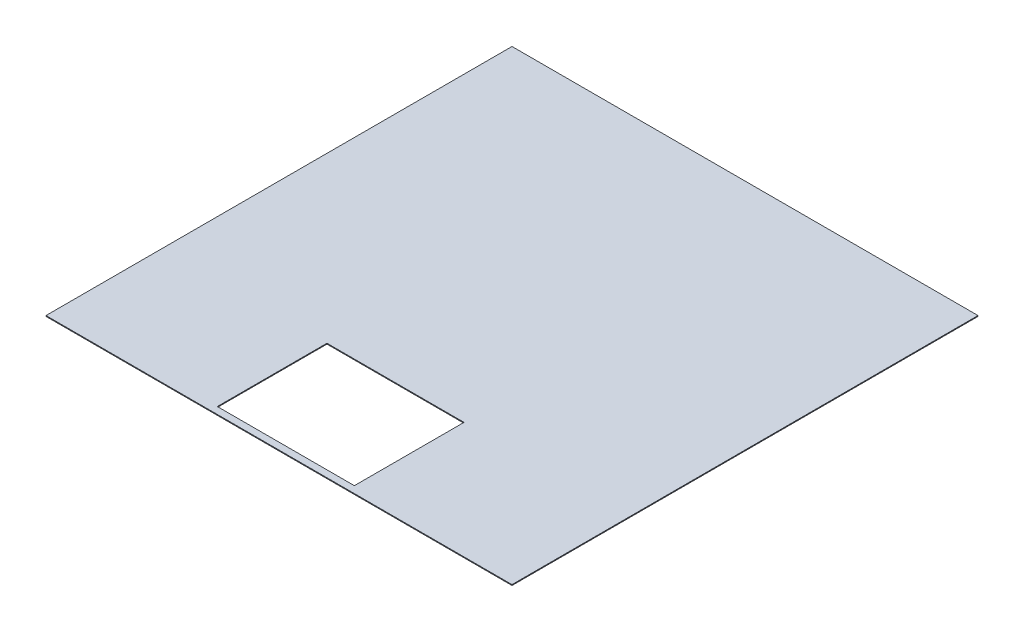
ISO-10303-21;
HEADER;
FILE_DESCRIPTION(('STEP AP214'),'2;1');
FILE_NAME('part.step','',(''),(''),'','','');
FILE_SCHEMA(('AUTOMOTIVE_DESIGN { 1 0 10303 214 1 1 1 1 }'));
ENDSEC;
DATA;
#1=APPLICATION_CONTEXT('core data for automotive mechanical design processes');
#2=APPLICATION_PROTOCOL_DEFINITION('international standard','automotive_design',2000,#1);
#3=PRODUCT_CONTEXT('',#1,'mechanical');
#4=PRODUCT('Part','Part','',(#3));
#5=PRODUCT_RELATED_PRODUCT_CATEGORY('part','',(#4));
#6=PRODUCT_DEFINITION_FORMATION('','',#4);
#7=PRODUCT_DEFINITION_CONTEXT('part definition',#1,'design');
#8=PRODUCT_DEFINITION('design','',#6,#7);
#9=PRODUCT_DEFINITION_SHAPE('','',#8);
#10=(LENGTH_UNIT() NAMED_UNIT(*) SI_UNIT(.MILLI.,.METRE.));
#11=(NAMED_UNIT(*) PLANE_ANGLE_UNIT() SI_UNIT($,.RADIAN.));
#12=(NAMED_UNIT(*) SI_UNIT($,.STERADIAN.) SOLID_ANGLE_UNIT());
#13=UNCERTAINTY_MEASURE_WITH_UNIT(LENGTH_MEASURE(1.E-05),#10,'distance_accuracy_value','');
#14=(GEOMETRIC_REPRESENTATION_CONTEXT(3) GLOBAL_UNCERTAINTY_ASSIGNED_CONTEXT((#13)) GLOBAL_UNIT_ASSIGNED_CONTEXT((#10,
#11,#12)) REPRESENTATION_CONTEXT('',''));
#15=CARTESIAN_POINT('',(0.,0.,0.));
#16=DIRECTION('',(0.,0.,1.));
#17=DIRECTION('',(1.,0.,0.));
#18=AXIS2_PLACEMENT_3D('',#15,#16,#17);
#19=CARTESIAN_POINT('',(0.,0.6,0.));
#20=DIRECTION('',(0.,-1.,0.));
#21=DIRECTION('',(0.,0.,-1.));
#22=AXIS2_PLACEMENT_3D('',#19,#20,#21);
#23=PLANE('',#22);
#24=DIRECTION('',(0.,0.,1.));
#25=VECTOR('',#24,1.);
#26=CARTESIAN_POINT('',(0.,0.6,340.));
#27=LINE('',#26,#25);
#28=CARTESIAN_POINT('',(0.,0.6,0.));
#29=VERTEX_POINT('',#28);
#30=CARTESIAN_POINT('',(0.,0.6,340.));
#31=VERTEX_POINT('',#30);
#32=EDGE_CURVE('E153',#29,#31,#27,.T.);
#33=ORIENTED_EDGE('',*,*,#32,.T.);
#34=DIRECTION('',(1.,0.,0.));
#35=VECTOR('',#34,1.);
#36=CARTESIAN_POINT('',(340.,0.6,340.));
#37=LINE('',#36,#35);
#38=CARTESIAN_POINT('',(340.,0.6,340.));
#39=VERTEX_POINT('',#38);
#40=EDGE_CURVE('E157',#31,#39,#37,.T.);
#41=ORIENTED_EDGE('',*,*,#40,.T.);
#42=DIRECTION('',(0.,0.,-1.));
#43=VECTOR('',#42,1.);
#44=CARTESIAN_POINT('',(340.,0.6,0.));
#45=LINE('',#44,#43);
#46=CARTESIAN_POINT('',(340.,0.6,0.));
#47=VERTEX_POINT('',#46);
#48=EDGE_CURVE('E161',#39,#47,#45,.T.);
#49=ORIENTED_EDGE('',*,*,#48,.T.);
#50=DIRECTION('',(-1.,0.,0.));
#51=VECTOR('',#50,1.);
#52=CARTESIAN_POINT('',(0.,0.6,0.));
#53=LINE('',#52,#51);
#54=EDGE_CURVE('E164',#47,#29,#53,.T.);
#55=ORIENTED_EDGE('',*,*,#54,.T.);
#56=EDGE_LOOP('',(#33,#41,#49,#55));
#57=FACE_BOUND('',#56,.T.);
#58=DIRECTION('',(0.,0.,-1.));
#59=VECTOR('',#58,1.);
#60=CARTESIAN_POINT('',(220.,0.6,255.));
#61=LINE('',#60,#59);
#62=CARTESIAN_POINT('',(220.,0.6,335.));
#63=VERTEX_POINT('',#62);
#64=CARTESIAN_POINT('',(220.,0.6,255.));
#65=VERTEX_POINT('',#64);
#66=EDGE_CURVE('E105',#63,#65,#61,.T.);
#67=ORIENTED_EDGE('',*,*,#66,.F.);
#68=DIRECTION('',(1.,0.,0.));
#69=VECTOR('',#68,1.);
#70=CARTESIAN_POINT('',(220.,0.6,335.));
#71=LINE('',#70,#69);
#72=CARTESIAN_POINT('',(120.,0.6,335.));
#73=VERTEX_POINT('',#72);
#74=EDGE_CURVE('E131',#73,#63,#71,.T.);
#75=ORIENTED_EDGE('',*,*,#74,.F.);
#76=DIRECTION('',(0.,0.,1.));
#77=VECTOR('',#76,1.);
#78=CARTESIAN_POINT('',(120.,0.6,335.));
#79=LINE('',#78,#77);
#80=CARTESIAN_POINT('',(120.,0.6,255.));
#81=VERTEX_POINT('',#80);
#82=EDGE_CURVE('E127',#81,#73,#79,.T.);
#83=ORIENTED_EDGE('',*,*,#82,.F.);
#84=DIRECTION('',(-1.,0.,0.));
#85=VECTOR('',#84,1.);
#86=CARTESIAN_POINT('',(120.,0.6,255.));
#87=LINE('',#86,#85);
#88=EDGE_CURVE('E114',#65,#81,#87,.T.);
#89=ORIENTED_EDGE('',*,*,#88,.F.);
#90=EDGE_LOOP('',(#67,#75,#83,#89));
#91=FACE_BOUND('',#90,.T.);
#92=ADVANCED_FACE('F39',(#57,#91),#23,.F.);
#93=CARTESIAN_POINT('',(0.,0.,0.));
#94=DIRECTION('',(0.,-1.,0.));
#95=DIRECTION('',(0.,0.,-1.));
#96=AXIS2_PLACEMENT_3D('',#93,#94,#95);
#97=PLANE('',#96);
#98=DIRECTION('',(0.,0.,1.));
#99=VECTOR('',#98,1.);
#100=CARTESIAN_POINT('',(0.,0.,340.));
#101=LINE('',#100,#99);
#102=CARTESIAN_POINT('',(0.,0.,0.));
#103=VERTEX_POINT('',#102);
#104=CARTESIAN_POINT('',(0.,0.,340.));
#105=VERTEX_POINT('',#104);
#106=EDGE_CURVE('E123',#103,#105,#101,.T.);
#107=ORIENTED_EDGE('',*,*,#106,.F.);
#108=DIRECTION('',(-1.,0.,0.));
#109=VECTOR('',#108,1.);
#110=CARTESIAN_POINT('',(0.,0.,0.));
#111=LINE('',#110,#109);
#112=CARTESIAN_POINT('',(340.,0.,0.));
#113=VERTEX_POINT('',#112);
#114=EDGE_CURVE('E158',#113,#103,#111,.T.);
#115=ORIENTED_EDGE('',*,*,#114,.F.);
#116=DIRECTION('',(0.,0.,-1.));
#117=VECTOR('',#116,1.);
#118=CARTESIAN_POINT('',(340.,0.,0.));
#119=LINE('',#118,#117);
#120=CARTESIAN_POINT('',(340.,0.,340.));
#121=VERTEX_POINT('',#120);
#122=EDGE_CURVE('E174',#121,#113,#119,.T.);
#123=ORIENTED_EDGE('',*,*,#122,.F.);
#124=DIRECTION('',(1.,0.,0.));
#125=VECTOR('',#124,1.);
#126=CARTESIAN_POINT('',(340.,0.,340.));
#127=LINE('',#126,#125);
#128=EDGE_CURVE('E171',#105,#121,#127,.T.);
#129=ORIENTED_EDGE('',*,*,#128,.F.);
#130=EDGE_LOOP('',(#107,#115,#123,#129));
#131=FACE_BOUND('',#130,.T.);
#132=DIRECTION('',(1.,0.,0.));
#133=VECTOR('',#132,1.);
#134=CARTESIAN_POINT('',(220.,0.,335.));
#135=LINE('',#134,#133);
#136=CARTESIAN_POINT('',(120.,0.,335.));
#137=VERTEX_POINT('',#136);
#138=CARTESIAN_POINT('',(220.,0.,335.));
#139=VERTEX_POINT('',#138);
#140=EDGE_CURVE('E115',#137,#139,#135,.T.);
#141=ORIENTED_EDGE('',*,*,#140,.T.);
#142=DIRECTION('',(0.,0.,-1.));
#143=VECTOR('',#142,1.);
#144=CARTESIAN_POINT('',(220.,0.,255.));
#145=LINE('',#144,#143);
#146=CARTESIAN_POINT('',(220.,0.,255.));
#147=VERTEX_POINT('',#146);
#148=EDGE_CURVE('E63',#139,#147,#145,.T.);
#149=ORIENTED_EDGE('',*,*,#148,.T.);
#150=DIRECTION('',(-1.,0.,0.));
#151=VECTOR('',#150,1.);
#152=CARTESIAN_POINT('',(120.,0.,255.));
#153=LINE('',#152,#151);
#154=CARTESIAN_POINT('',(120.,0.,255.));
#155=VERTEX_POINT('',#154);
#156=EDGE_CURVE('E121',#147,#155,#153,.T.);
#157=ORIENTED_EDGE('',*,*,#156,.T.);
#158=DIRECTION('',(0.,0.,1.));
#159=VECTOR('',#158,1.);
#160=CARTESIAN_POINT('',(120.,0.,335.));
#161=LINE('',#160,#159);
#162=EDGE_CURVE('E140',#155,#137,#161,.T.);
#163=ORIENTED_EDGE('',*,*,#162,.T.);
#164=EDGE_LOOP('',(#141,#149,#157,#163));
#165=FACE_BOUND('',#164,.T.);
#166=ADVANCED_FACE('F197',(#131,#165),#97,.T.);
#167=CARTESIAN_POINT('',(0.,0.6,340.));
#168=DIRECTION('',(1.,0.,0.));
#169=DIRECTION('',(0.,0.,-1.));
#170=AXIS2_PLACEMENT_3D('',#167,#168,#169);
#171=PLANE('',#170);
#172=ORIENTED_EDGE('',*,*,#106,.T.);
#173=DIRECTION('',(0.,-1.,0.));
#174=VECTOR('',#173,1.);
#175=CARTESIAN_POINT('',(0.,0.6,340.));
#176=LINE('',#175,#174);
#177=EDGE_CURVE('E11',#31,#105,#176,.T.);
#178=ORIENTED_EDGE('',*,*,#177,.F.);
#179=ORIENTED_EDGE('',*,*,#32,.F.);
#180=DIRECTION('',(0.,-1.,0.));
#181=VECTOR('',#180,1.);
#182=CARTESIAN_POINT('',(0.,0.6,0.));
#183=LINE('',#182,#181);
#184=EDGE_CURVE('E167',#29,#103,#183,.T.);
#185=ORIENTED_EDGE('',*,*,#184,.T.);
#186=EDGE_LOOP('',(#172,#178,#179,#185));
#187=FACE_BOUND('',#186,.T.);
#188=ADVANCED_FACE('F41',(#187),#171,.F.);
#189=CARTESIAN_POINT('',(340.,0.6,340.));
#190=DIRECTION('',(0.,0.,-1.));
#191=DIRECTION('',(-1.,0.,0.));
#192=AXIS2_PLACEMENT_3D('',#189,#190,#191);
#193=PLANE('',#192);
#194=ORIENTED_EDGE('',*,*,#128,.T.);
#195=DIRECTION('',(0.,-1.,0.));
#196=VECTOR('',#195,1.);
#197=CARTESIAN_POINT('',(340.,0.6,340.));
#198=LINE('',#197,#196);
#199=EDGE_CURVE('E48',#39,#121,#198,.T.);
#200=ORIENTED_EDGE('',*,*,#199,.F.);
#201=ORIENTED_EDGE('',*,*,#40,.F.);
#202=ORIENTED_EDGE('',*,*,#177,.T.);
#203=EDGE_LOOP('',(#194,#200,#201,#202));
#204=FACE_BOUND('',#203,.T.);
#205=ADVANCED_FACE('F207',(#204),#193,.F.);
#206=CARTESIAN_POINT('',(340.,0.6,0.));
#207=DIRECTION('',(-1.,0.,0.));
#208=DIRECTION('',(0.,0.,1.));
#209=AXIS2_PLACEMENT_3D('',#206,#207,#208);
#210=PLANE('',#209);
#211=ORIENTED_EDGE('',*,*,#122,.T.);
#212=DIRECTION('',(0.,-1.,0.));
#213=VECTOR('',#212,1.);
#214=CARTESIAN_POINT('',(340.,0.6,0.));
#215=LINE('',#214,#213);
#216=EDGE_CURVE('E182',#47,#113,#215,.T.);
#217=ORIENTED_EDGE('',*,*,#216,.F.);
#218=ORIENTED_EDGE('',*,*,#48,.F.);
#219=ORIENTED_EDGE('',*,*,#199,.T.);
#220=EDGE_LOOP('',(#211,#217,#218,#219));
#221=FACE_BOUND('',#220,.T.);
#222=ADVANCED_FACE('F191',(#221),#210,.F.);
#223=CARTESIAN_POINT('',(0.,0.6,0.));
#224=DIRECTION('',(0.,0.,1.));
#225=DIRECTION('',(1.,0.,0.));
#226=AXIS2_PLACEMENT_3D('',#223,#224,#225);
#227=PLANE('',#226);
#228=ORIENTED_EDGE('',*,*,#114,.T.);
#229=ORIENTED_EDGE('',*,*,#184,.F.);
#230=ORIENTED_EDGE('',*,*,#54,.F.);
#231=ORIENTED_EDGE('',*,*,#216,.T.);
#232=EDGE_LOOP('',(#228,#229,#230,#231));
#233=FACE_BOUND('',#232,.T.);
#234=ADVANCED_FACE('F201',(#233),#227,.F.);
#235=CARTESIAN_POINT('',(220.,0.6,255.));
#236=DIRECTION('',(-1.,0.,0.));
#237=DIRECTION('',(0.,0.,1.));
#238=AXIS2_PLACEMENT_3D('',#235,#236,#237);
#239=PLANE('',#238);
#240=ORIENTED_EDGE('',*,*,#148,.F.);
#241=DIRECTION('',(0.,-1.,0.));
#242=VECTOR('',#241,1.);
#243=CARTESIAN_POINT('',(220.,0.6,335.));
#244=LINE('',#243,#242);
#245=EDGE_CURVE('E109',#63,#139,#244,.T.);
#246=ORIENTED_EDGE('',*,*,#245,.F.);
#247=ORIENTED_EDGE('',*,*,#66,.T.);
#248=DIRECTION('',(0.,-1.,0.));
#249=VECTOR('',#248,1.);
#250=CARTESIAN_POINT('',(220.,0.6,255.));
#251=LINE('',#250,#249);
#252=EDGE_CURVE('E108',#65,#147,#251,.T.);
#253=ORIENTED_EDGE('',*,*,#252,.T.);
#254=EDGE_LOOP('',(#240,#246,#247,#253));
#255=FACE_BOUND('',#254,.T.);
#256=ADVANCED_FACE('F107',(#255),#239,.T.);
#257=CARTESIAN_POINT('',(120.,0.6,255.));
#258=DIRECTION('',(0.,0.,1.));
#259=DIRECTION('',(1.,0.,0.));
#260=AXIS2_PLACEMENT_3D('',#257,#258,#259);
#261=PLANE('',#260);
#262=ORIENTED_EDGE('',*,*,#156,.F.);
#263=ORIENTED_EDGE('',*,*,#252,.F.);
#264=ORIENTED_EDGE('',*,*,#88,.T.);
#265=DIRECTION('',(0.,-1.,0.));
#266=VECTOR('',#265,1.);
#267=CARTESIAN_POINT('',(120.,0.6,255.));
#268=LINE('',#267,#266);
#269=EDGE_CURVE('E124',#81,#155,#268,.T.);
#270=ORIENTED_EDGE('',*,*,#269,.T.);
#271=EDGE_LOOP('',(#262,#263,#264,#270));
#272=FACE_BOUND('',#271,.T.);
#273=ADVANCED_FACE('F118',(#272),#261,.T.);
#274=CARTESIAN_POINT('',(120.,0.6,335.));
#275=DIRECTION('',(1.,0.,0.));
#276=DIRECTION('',(0.,0.,-1.));
#277=AXIS2_PLACEMENT_3D('',#274,#275,#276);
#278=PLANE('',#277);
#279=ORIENTED_EDGE('',*,*,#162,.F.);
#280=ORIENTED_EDGE('',*,*,#269,.F.);
#281=ORIENTED_EDGE('',*,*,#82,.T.);
#282=DIRECTION('',(0.,-1.,0.));
#283=VECTOR('',#282,1.);
#284=CARTESIAN_POINT('',(120.,0.6,335.));
#285=LINE('',#284,#283);
#286=EDGE_CURVE('E55',#73,#137,#285,.T.);
#287=ORIENTED_EDGE('',*,*,#286,.T.);
#288=EDGE_LOOP('',(#279,#280,#281,#287));
#289=FACE_BOUND('',#288,.T.);
#290=ADVANCED_FACE('F230',(#289),#278,.T.);
#291=CARTESIAN_POINT('',(220.,0.6,335.));
#292=DIRECTION('',(0.,0.,-1.));
#293=DIRECTION('',(-1.,0.,0.));
#294=AXIS2_PLACEMENT_3D('',#291,#292,#293);
#295=PLANE('',#294);
#296=ORIENTED_EDGE('',*,*,#140,.F.);
#297=ORIENTED_EDGE('',*,*,#286,.F.);
#298=ORIENTED_EDGE('',*,*,#74,.T.);
#299=ORIENTED_EDGE('',*,*,#245,.T.);
#300=EDGE_LOOP('',(#296,#297,#298,#299));
#301=FACE_BOUND('',#300,.T.);
#302=ADVANCED_FACE('F234',(#301),#295,.T.);
#303=CLOSED_SHELL('',(#92,#166,#188,#205,#222,#234,#256,#273,#290,#302));
#304=MANIFOLD_SOLID_BREP('B2',#303);
#305=ADVANCED_BREP_SHAPE_REPRESENTATION('',(#18,#304),#14);
#306=SHAPE_DEFINITION_REPRESENTATION(#9,#305);
ENDSEC;
END-ISO-10303-21;
